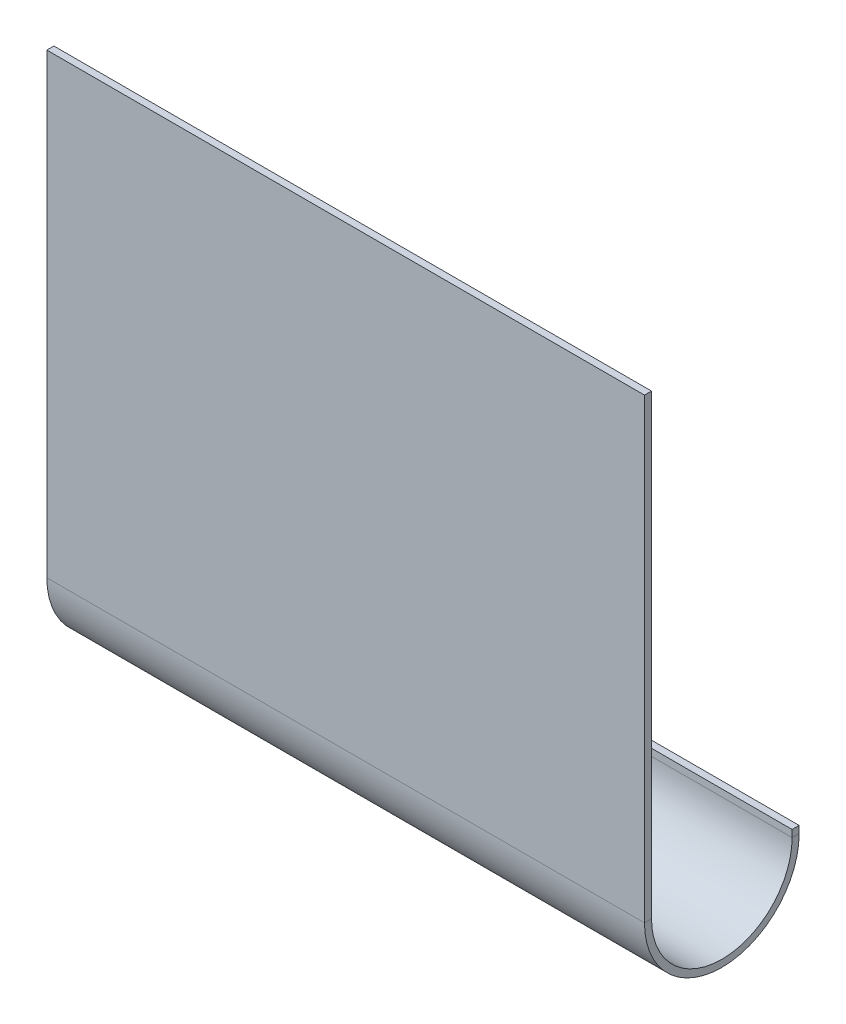
ISO-10303-21;
HEADER;
FILE_DESCRIPTION(('STEP AP214'),'2;1');
FILE_NAME('part.step','',(''),(''),'','','');
FILE_SCHEMA(('AUTOMOTIVE_DESIGN { 1 0 10303 214 1 1 1 1 }'));
ENDSEC;
DATA;
#1=APPLICATION_CONTEXT('core data for automotive mechanical design processes');
#2=APPLICATION_PROTOCOL_DEFINITION('international standard','automotive_design',2000,#1);
#3=PRODUCT_CONTEXT('',#1,'mechanical');
#4=PRODUCT('Part','Part','',(#3));
#5=PRODUCT_RELATED_PRODUCT_CATEGORY('part','',(#4));
#6=PRODUCT_DEFINITION_FORMATION('','',#4);
#7=PRODUCT_DEFINITION_CONTEXT('part definition',#1,'design');
#8=PRODUCT_DEFINITION('design','',#6,#7);
#9=PRODUCT_DEFINITION_SHAPE('','',#8);
#10=(LENGTH_UNIT() NAMED_UNIT(*) SI_UNIT(.MILLI.,.METRE.));
#11=(NAMED_UNIT(*) PLANE_ANGLE_UNIT() SI_UNIT($,.RADIAN.));
#12=(NAMED_UNIT(*) SI_UNIT($,.STERADIAN.) SOLID_ANGLE_UNIT());
#13=UNCERTAINTY_MEASURE_WITH_UNIT(LENGTH_MEASURE(1.E-05),#10,'distance_accuracy_value','');
#14=(GEOMETRIC_REPRESENTATION_CONTEXT(3) GLOBAL_UNCERTAINTY_ASSIGNED_CONTEXT((#13)) GLOBAL_UNIT_ASSIGNED_CONTEXT((#10,
#11,#12)) REPRESENTATION_CONTEXT('',''));
#15=CARTESIAN_POINT('',(0.,0.,0.));
#16=DIRECTION('',(0.,0.,1.));
#17=DIRECTION('',(1.,0.,0.));
#18=AXIS2_PLACEMENT_3D('',#15,#16,#17);
#19=CARTESIAN_POINT('',(4.25,-12.9,0.));
#20=DIRECTION('',(-1.,0.,0.));
#21=DIRECTION('',(0.,0.,1.));
#22=AXIS2_PLACEMENT_3D('',#19,#20,#21);
#23=PLANE('',#22);
#24=DIRECTION('',(0.,1.,0.));
#25=VECTOR('',#24,1.);
#26=CARTESIAN_POINT('',(4.25,-12.9,0.));
#27=LINE('',#26,#25);
#28=CARTESIAN_POINT('',(4.25,-12.9,0.));
#29=VERTEX_POINT('',#28);
#30=CARTESIAN_POINT('',(4.25,-6.4,0.));
#31=VERTEX_POINT('',#30);
#32=EDGE_CURVE('E109',#29,#31,#27,.T.);
#33=ORIENTED_EDGE('',*,*,#32,.T.);
#34=DIRECTION('',(0.,0.,1.));
#35=VECTOR('',#34,1.);
#36=CARTESIAN_POINT('',(4.25,-6.4,0.));
#37=LINE('',#36,#35);
#38=CARTESIAN_POINT('',(4.25,-6.4,0.1));
#39=VERTEX_POINT('',#38);
#40=EDGE_CURVE('E11',#31,#39,#37,.T.);
#41=ORIENTED_EDGE('',*,*,#40,.T.);
#42=DIRECTION('',(0.,1.,0.));
#43=VECTOR('',#42,1.);
#44=CARTESIAN_POINT('',(4.25,-12.9,0.1));
#45=LINE('',#44,#43);
#46=CARTESIAN_POINT('',(4.25,-12.9,0.1));
#47=VERTEX_POINT('',#46);
#48=EDGE_CURVE('E27',#47,#39,#45,.T.);
#49=ORIENTED_EDGE('',*,*,#48,.F.);
#50=DIRECTION('',(0.,0.,1.));
#51=VECTOR('',#50,1.);
#52=CARTESIAN_POINT('',(4.25,-12.9,0.));
#53=LINE('',#52,#51);
#54=EDGE_CURVE('E175',#29,#47,#53,.T.);
#55=ORIENTED_EDGE('',*,*,#54,.F.);
#56=EDGE_LOOP('',(#33,#41,#49,#55));
#57=FACE_BOUND('',#56,.T.);
#58=ADVANCED_FACE('F16',(#57),#23,.F.);
#59=CARTESIAN_POINT('',(4.25,-6.4,0.));
#60=DIRECTION('',(0.,-1.,0.));
#61=DIRECTION('',(0.,0.,-1.));
#62=AXIS2_PLACEMENT_3D('',#59,#60,#61);
#63=PLANE('',#62);
#64=DIRECTION('',(-1.,0.,0.));
#65=VECTOR('',#64,1.);
#66=CARTESIAN_POINT('',(4.25,-6.4,0.));
#67=LINE('',#66,#65);
#68=CARTESIAN_POINT('',(-4.25,-6.4,0.));
#69=VERTEX_POINT('',#68);
#70=EDGE_CURVE('E118',#31,#69,#67,.T.);
#71=ORIENTED_EDGE('',*,*,#70,.T.);
#72=DIRECTION('',(0.,0.,1.));
#73=VECTOR('',#72,1.);
#74=CARTESIAN_POINT('',(-4.25,-6.4,0.));
#75=LINE('',#74,#73);
#76=CARTESIAN_POINT('',(-4.25,-6.4,0.1));
#77=VERTEX_POINT('',#76);
#78=EDGE_CURVE('E121',#69,#77,#75,.T.);
#79=ORIENTED_EDGE('',*,*,#78,.T.);
#80=DIRECTION('',(-1.,0.,0.));
#81=VECTOR('',#80,1.);
#82=CARTESIAN_POINT('',(4.25,-6.4,0.1));
#83=LINE('',#82,#81);
#84=EDGE_CURVE('E123',#39,#77,#83,.T.);
#85=ORIENTED_EDGE('',*,*,#84,.F.);
#86=ORIENTED_EDGE('',*,*,#40,.F.);
#87=EDGE_LOOP('',(#71,#79,#85,#86));
#88=FACE_BOUND('',#87,.T.);
#89=ADVANCED_FACE('F119',(#88),#63,.F.);
#90=CARTESIAN_POINT('',(0.,-9.65,0.1));
#91=DIRECTION('',(0.,0.,1.));
#92=DIRECTION('',(1.,0.,0.));
#93=AXIS2_PLACEMENT_3D('',#90,#91,#92);
#94=PLANE('',#93);
#95=ORIENTED_EDGE('',*,*,#84,.T.);
#96=DIRECTION('',(0.,-1.,0.));
#97=VECTOR('',#96,1.);
#98=CARTESIAN_POINT('',(-4.25,-6.4,0.1));
#99=LINE('',#98,#97);
#100=CARTESIAN_POINT('',(-4.25,-12.9,0.1));
#101=VERTEX_POINT('',#100);
#102=EDGE_CURVE('E74',#77,#101,#99,.T.);
#103=ORIENTED_EDGE('',*,*,#102,.T.);
#104=DIRECTION('',(1.,0.,0.));
#105=VECTOR('',#104,1.);
#106=CARTESIAN_POINT('',(-4.25,-12.9,0.1));
#107=LINE('',#106,#105);
#108=EDGE_CURVE('E134',#101,#47,#107,.T.);
#109=ORIENTED_EDGE('',*,*,#108,.T.);
#110=ORIENTED_EDGE('',*,*,#48,.T.);
#111=EDGE_LOOP('',(#95,#103,#109,#110));
#112=FACE_BOUND('',#111,.T.);
#113=ADVANCED_FACE('F389',(#112),#94,.T.);
#114=CARTESIAN_POINT('',(0.,-9.65,0.));
#115=DIRECTION('',(0.,0.,1.));
#116=DIRECTION('',(1.,0.,0.));
#117=AXIS2_PLACEMENT_3D('',#114,#115,#116);
#118=PLANE('',#117);
#119=ORIENTED_EDGE('',*,*,#32,.F.);
#120=DIRECTION('',(1.,0.,0.));
#121=VECTOR('',#120,1.);
#122=CARTESIAN_POINT('',(-4.25,-12.9,0.));
#123=LINE('',#122,#121);
#124=CARTESIAN_POINT('',(-4.25,-12.9,0.));
#125=VERTEX_POINT('',#124);
#126=EDGE_CURVE('E131',#125,#29,#123,.T.);
#127=ORIENTED_EDGE('',*,*,#126,.F.);
#128=DIRECTION('',(0.,-1.,0.));
#129=VECTOR('',#128,1.);
#130=CARTESIAN_POINT('',(-4.25,-6.4,0.));
#131=LINE('',#130,#129);
#132=EDGE_CURVE('E61',#69,#125,#131,.T.);
#133=ORIENTED_EDGE('',*,*,#132,.F.);
#134=ORIENTED_EDGE('',*,*,#70,.F.);
#135=EDGE_LOOP('',(#119,#127,#133,#134));
#136=FACE_BOUND('',#135,.T.);
#137=ADVANCED_FACE('F129',(#136),#118,.F.);
#138=CARTESIAN_POINT('',(4.25,-12.9,-1.));
#139=DIRECTION('',(1.,0.,0.));
#140=DIRECTION('',(0.,1.,0.));
#141=AXIS2_PLACEMENT_3D('',#138,#139,#140);
#142=PLANE('',#141);
#143=CARTESIAN_POINT('',(4.25,-12.9,-1.));
#144=DIRECTION('',(1.,0.,0.));
#145=DIRECTION('',(0.,0.,1.));
#146=AXIS2_PLACEMENT_3D('',#143,#144,#145);
#147=CIRCLE('',#146,1.1);
#148=CARTESIAN_POINT('',(4.25,-12.9,-2.1));
#149=VERTEX_POINT('',#148);
#150=EDGE_CURVE('E142',#47,#149,#147,.T.);
#151=ORIENTED_EDGE('',*,*,#150,.T.);
#152=DIRECTION('',(0.,0.,1.));
#153=VECTOR('',#152,1.);
#154=CARTESIAN_POINT('',(4.25,-12.9,-2.1));
#155=LINE('',#154,#153);
#156=CARTESIAN_POINT('',(4.25,-12.9,-2.));
#157=VERTEX_POINT('',#156);
#158=EDGE_CURVE('E127',#149,#157,#155,.T.);
#159=ORIENTED_EDGE('',*,*,#158,.T.);
#160=CARTESIAN_POINT('',(4.25,-12.9,-1.));
#161=DIRECTION('',(1.,0.,0.));
#162=DIRECTION('',(0.,0.,1.));
#163=AXIS2_PLACEMENT_3D('',#160,#161,#162);
#164=CIRCLE('',#163,1.);
#165=EDGE_CURVE('E148',#29,#157,#164,.T.);
#166=ORIENTED_EDGE('',*,*,#165,.F.);
#167=ORIENTED_EDGE('',*,*,#54,.T.);
#168=EDGE_LOOP('',(#151,#159,#166,#167));
#169=FACE_BOUND('',#168,.T.);
#170=ADVANCED_FACE('F372',(#169),#142,.T.);
#171=CARTESIAN_POINT('',(4.25,-12.8,-2.));
#172=DIRECTION('',(-1.,0.,0.));
#173=DIRECTION('',(0.,0.,1.));
#174=AXIS2_PLACEMENT_3D('',#171,#172,#173);
#175=PLANE('',#174);
#176=DIRECTION('',(0.,-1.,0.));
#177=VECTOR('',#176,1.);
#178=CARTESIAN_POINT('',(4.25,-12.8,-2.));
#179=LINE('',#178,#177);
#180=CARTESIAN_POINT('',(4.25,-12.8,-2.));
#181=VERTEX_POINT('',#180);
#182=EDGE_CURVE('E154',#181,#157,#179,.T.);
#183=ORIENTED_EDGE('',*,*,#182,.T.);
#184=ORIENTED_EDGE('',*,*,#158,.F.);
#185=DIRECTION('',(0.,-1.,0.));
#186=VECTOR('',#185,1.);
#187=CARTESIAN_POINT('',(4.25,-12.8,-2.1));
#188=LINE('',#187,#186);
#189=CARTESIAN_POINT('',(4.25,-12.8,-2.1));
#190=VERTEX_POINT('',#189);
#191=EDGE_CURVE('E149',#190,#149,#188,.T.);
#192=ORIENTED_EDGE('',*,*,#191,.F.);
#193=DIRECTION('',(0.,0.,-1.));
#194=VECTOR('',#193,1.);
#195=CARTESIAN_POINT('',(4.25,-12.8,-2.));
#196=LINE('',#195,#194);
#197=EDGE_CURVE('E186',#181,#190,#196,.T.);
#198=ORIENTED_EDGE('',*,*,#197,.F.);
#199=EDGE_LOOP('',(#183,#184,#192,#198));
#200=FACE_BOUND('',#199,.T.);
#201=ADVANCED_FACE('F230',(#200),#175,.F.);
#202=CARTESIAN_POINT('',(-4.25,-6.4,0.));
#203=DIRECTION('',(1.,0.,0.));
#204=DIRECTION('',(0.,1.,0.));
#205=AXIS2_PLACEMENT_3D('',#202,#203,#204);
#206=PLANE('',#205);
#207=ORIENTED_EDGE('',*,*,#132,.T.);
#208=DIRECTION('',(0.,0.,1.));
#209=VECTOR('',#208,1.);
#210=CARTESIAN_POINT('',(-4.25,-12.9,0.));
#211=LINE('',#210,#209);
#212=EDGE_CURVE('E177',#125,#101,#211,.T.);
#213=ORIENTED_EDGE('',*,*,#212,.T.);
#214=ORIENTED_EDGE('',*,*,#102,.F.);
#215=ORIENTED_EDGE('',*,*,#78,.F.);
#216=EDGE_LOOP('',(#207,#213,#214,#215));
#217=FACE_BOUND('',#216,.T.);
#218=ADVANCED_FACE('F125',(#217),#206,.F.);
#219=CARTESIAN_POINT('',(-4.25,-12.9,-1.));
#220=DIRECTION('',(1.,0.,0.));
#221=DIRECTION('',(0.,0.,1.));
#222=AXIS2_PLACEMENT_3D('',#219,#220,#221);
#223=CYLINDRICAL_SURFACE('',#222,1.1);
#224=CARTESIAN_POINT('',(-4.25,-12.9,-1.));
#225=DIRECTION('',(1.,0.,0.));
#226=DIRECTION('',(0.,0.,1.));
#227=AXIS2_PLACEMENT_3D('',#224,#225,#226);
#228=CIRCLE('',#227,1.1);
#229=CARTESIAN_POINT('',(-4.25,-12.9,-2.1));
#230=VERTEX_POINT('',#229);
#231=EDGE_CURVE('E169',#101,#230,#228,.T.);
#232=ORIENTED_EDGE('',*,*,#231,.T.);
#233=DIRECTION('',(1.,0.,0.));
#234=VECTOR('',#233,1.);
#235=CARTESIAN_POINT('',(-4.25,-12.9,-2.1));
#236=LINE('',#235,#234);
#237=EDGE_CURVE('E153',#230,#149,#236,.T.);
#238=ORIENTED_EDGE('',*,*,#237,.T.);
#239=ORIENTED_EDGE('',*,*,#150,.F.);
#240=ORIENTED_EDGE('',*,*,#108,.F.);
#241=EDGE_LOOP('',(#232,#238,#239,#240));
#242=FACE_BOUND('',#241,.T.);
#243=ADVANCED_FACE('F347',(#242),#223,.T.);
#244=CARTESIAN_POINT('',(4.25,-12.9,-1.));
#245=DIRECTION('',(-1.,0.,0.));
#246=DIRECTION('',(0.,0.,1.));
#247=AXIS2_PLACEMENT_3D('',#244,#245,#246);
#248=CYLINDRICAL_SURFACE('',#247,1.);
#249=ORIENTED_EDGE('',*,*,#165,.T.);
#250=DIRECTION('',(-1.,0.,0.));
#251=VECTOR('',#250,1.);
#252=CARTESIAN_POINT('',(4.25,-12.9,-2.));
#253=LINE('',#252,#251);
#254=CARTESIAN_POINT('',(-4.25,-12.9,-2.));
#255=VERTEX_POINT('',#254);
#256=EDGE_CURVE('E157',#157,#255,#253,.T.);
#257=ORIENTED_EDGE('',*,*,#256,.T.);
#258=CARTESIAN_POINT('',(-4.25,-12.9,-1.));
#259=DIRECTION('',(1.,0.,0.));
#260=DIRECTION('',(0.,0.,1.));
#261=AXIS2_PLACEMENT_3D('',#258,#259,#260);
#262=CIRCLE('',#261,1.);
#263=EDGE_CURVE('E164',#125,#255,#262,.T.);
#264=ORIENTED_EDGE('',*,*,#263,.F.);
#265=ORIENTED_EDGE('',*,*,#126,.T.);
#266=EDGE_LOOP('',(#249,#257,#264,#265));
#267=FACE_BOUND('',#266,.T.);
#268=ADVANCED_FACE('F18',(#267),#248,.F.);
#269=CARTESIAN_POINT('',(0.,-12.85,-2.1));
#270=DIRECTION('',(0.,0.,-1.));
#271=DIRECTION('',(0.,-1.,0.));
#272=AXIS2_PLACEMENT_3D('',#269,#270,#271);
#273=PLANE('',#272);
#274=ORIENTED_EDGE('',*,*,#237,.F.);
#275=DIRECTION('',(0.,1.,0.));
#276=VECTOR('',#275,1.);
#277=CARTESIAN_POINT('',(-4.25,-12.9,-2.1));
#278=LINE('',#277,#276);
#279=CARTESIAN_POINT('',(-4.25,-12.8,-2.1));
#280=VERTEX_POINT('',#279);
#281=EDGE_CURVE('E165',#230,#280,#278,.T.);
#282=ORIENTED_EDGE('',*,*,#281,.T.);
#283=DIRECTION('',(1.,0.,0.));
#284=VECTOR('',#283,1.);
#285=CARTESIAN_POINT('',(-4.25,-12.8,-2.1));
#286=LINE('',#285,#284);
#287=EDGE_CURVE('E158',#280,#190,#286,.T.);
#288=ORIENTED_EDGE('',*,*,#287,.T.);
#289=ORIENTED_EDGE('',*,*,#191,.T.);
#290=EDGE_LOOP('',(#274,#282,#288,#289));
#291=FACE_BOUND('',#290,.T.);
#292=ADVANCED_FACE('F327',(#291),#273,.T.);
#293=CARTESIAN_POINT('',(0.,-12.85,-2.));
#294=DIRECTION('',(0.,0.,-1.));
#295=DIRECTION('',(0.,-1.,0.));
#296=AXIS2_PLACEMENT_3D('',#293,#294,#295);
#297=PLANE('',#296);
#298=ORIENTED_EDGE('',*,*,#182,.F.);
#299=DIRECTION('',(1.,0.,0.));
#300=VECTOR('',#299,1.);
#301=CARTESIAN_POINT('',(-4.25,-12.8,-2.));
#302=LINE('',#301,#300);
#303=CARTESIAN_POINT('',(-4.25,-12.8,-2.));
#304=VERTEX_POINT('',#303);
#305=EDGE_CURVE('E179',#304,#181,#302,.T.);
#306=ORIENTED_EDGE('',*,*,#305,.F.);
#307=DIRECTION('',(0.,1.,0.));
#308=VECTOR('',#307,1.);
#309=CARTESIAN_POINT('',(-4.25,-12.9,-2.));
#310=LINE('',#309,#308);
#311=EDGE_CURVE('E20',#255,#304,#310,.T.);
#312=ORIENTED_EDGE('',*,*,#311,.F.);
#313=ORIENTED_EDGE('',*,*,#256,.F.);
#314=EDGE_LOOP('',(#298,#306,#312,#313));
#315=FACE_BOUND('',#314,.T.);
#316=ADVANCED_FACE('F226',(#315),#297,.F.);
#317=CARTESIAN_POINT('',(-4.25,-12.8,-2.));
#318=DIRECTION('',(0.,-1.,0.));
#319=DIRECTION('',(0.,0.,-1.));
#320=AXIS2_PLACEMENT_3D('',#317,#318,#319);
#321=PLANE('',#320);
#322=ORIENTED_EDGE('',*,*,#305,.T.);
#323=ORIENTED_EDGE('',*,*,#197,.T.);
#324=ORIENTED_EDGE('',*,*,#287,.F.);
#325=DIRECTION('',(0.,0.,-1.));
#326=VECTOR('',#325,1.);
#327=CARTESIAN_POINT('',(-4.25,-12.8,-2.));
#328=LINE('',#327,#326);
#329=EDGE_CURVE('E200',#304,#280,#328,.T.);
#330=ORIENTED_EDGE('',*,*,#329,.F.);
#331=EDGE_LOOP('',(#322,#323,#324,#330));
#332=FACE_BOUND('',#331,.T.);
#333=ADVANCED_FACE('F235',(#332),#321,.F.);
#334=CARTESIAN_POINT('',(-4.25,-12.9,-1.));
#335=DIRECTION('',(1.,0.,0.));
#336=DIRECTION('',(0.,1.,0.));
#337=AXIS2_PLACEMENT_3D('',#334,#335,#336);
#338=PLANE('',#337);
#339=ORIENTED_EDGE('',*,*,#263,.T.);
#340=DIRECTION('',(0.,0.,-1.));
#341=VECTOR('',#340,1.);
#342=CARTESIAN_POINT('',(-4.25,-12.9,-2.));
#343=LINE('',#342,#341);
#344=EDGE_CURVE('E160',#255,#230,#343,.T.);
#345=ORIENTED_EDGE('',*,*,#344,.T.);
#346=ORIENTED_EDGE('',*,*,#231,.F.);
#347=ORIENTED_EDGE('',*,*,#212,.F.);
#348=EDGE_LOOP('',(#339,#345,#346,#347));
#349=FACE_BOUND('',#348,.T.);
#350=ADVANCED_FACE('F292',(#349),#338,.F.);
#351=CARTESIAN_POINT('',(-4.25,-12.9,-2.));
#352=DIRECTION('',(1.,0.,0.));
#353=DIRECTION('',(0.,0.,1.));
#354=AXIS2_PLACEMENT_3D('',#351,#352,#353);
#355=PLANE('',#354);
#356=ORIENTED_EDGE('',*,*,#311,.T.);
#357=ORIENTED_EDGE('',*,*,#329,.T.);
#358=ORIENTED_EDGE('',*,*,#281,.F.);
#359=ORIENTED_EDGE('',*,*,#344,.F.);
#360=EDGE_LOOP('',(#356,#357,#358,#359));
#361=FACE_BOUND('',#360,.T.);
#362=ADVANCED_FACE('F239',(#361),#355,.F.);
#363=CLOSED_SHELL('',(#58,#89,#113,#137,#170,#201,#218,#243,#268,#292,#316,#333,#350,#362));
#364=MANIFOLD_SOLID_BREP('B1',#363);
#365=ADVANCED_BREP_SHAPE_REPRESENTATION('',(#18,#364),#14);
#366=SHAPE_DEFINITION_REPRESENTATION(#9,#365);
ENDSEC;
END-ISO-10303-21;
